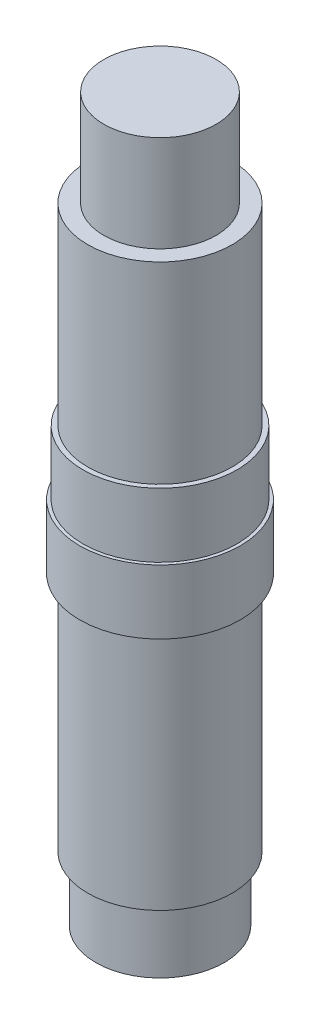
ISO-10303-21;
HEADER;
FILE_DESCRIPTION(('STEP AP214'),'2;1');
FILE_NAME('part.step','',(''),(''),'','','');
FILE_SCHEMA(('AUTOMOTIVE_DESIGN { 1 0 10303 214 1 1 1 1 }'));
ENDSEC;
DATA;
#1=APPLICATION_CONTEXT('core data for automotive mechanical design processes');
#2=APPLICATION_PROTOCOL_DEFINITION('international standard','automotive_design',2000,#1);
#3=PRODUCT_CONTEXT('',#1,'mechanical');
#4=PRODUCT('Part','Part','',(#3));
#5=PRODUCT_RELATED_PRODUCT_CATEGORY('part','',(#4));
#6=PRODUCT_DEFINITION_FORMATION('','',#4);
#7=PRODUCT_DEFINITION_CONTEXT('part definition',#1,'design');
#8=PRODUCT_DEFINITION('design','',#6,#7);
#9=PRODUCT_DEFINITION_SHAPE('','',#8);
#10=(LENGTH_UNIT() NAMED_UNIT(*) SI_UNIT(.MILLI.,.METRE.));
#11=(NAMED_UNIT(*) PLANE_ANGLE_UNIT() SI_UNIT($,.RADIAN.));
#12=(NAMED_UNIT(*) SI_UNIT($,.STERADIAN.) SOLID_ANGLE_UNIT());
#13=UNCERTAINTY_MEASURE_WITH_UNIT(LENGTH_MEASURE(1.E-05),#10,'distance_accuracy_value','');
#14=(GEOMETRIC_REPRESENTATION_CONTEXT(3) GLOBAL_UNCERTAINTY_ASSIGNED_CONTEXT((#13)) GLOBAL_UNIT_ASSIGNED_CONTEXT((#10,
#11,#12)) REPRESENTATION_CONTEXT('',''));
#15=CARTESIAN_POINT('',(0.,0.,0.));
#16=DIRECTION('',(0.,0.,1.));
#17=DIRECTION('',(1.,0.,0.));
#18=AXIS2_PLACEMENT_3D('',#15,#16,#17);
#19=CARTESIAN_POINT('',(0.,225.,0.));
#20=DIRECTION('',(0.,-1.,0.));
#21=DIRECTION('',(0.,0.,-1.));
#22=AXIS2_PLACEMENT_3D('',#19,#20,#21);
#23=CYLINDRICAL_SURFACE('',#22,17.5);
#24=CARTESIAN_POINT('',(0.,225.,0.));
#25=DIRECTION('',(0.,1.,0.));
#26=DIRECTION('',(0.,0.,1.));
#27=AXIS2_PLACEMENT_3D('',#24,#25,#26);
#28=CIRCLE('',#27,17.5);
#29=CARTESIAN_POINT('',(0.,225.,17.5));
#30=VERTEX_POINT('',#29);
#31=EDGE_CURVE('E11',#30,#30,#28,.T.);
#32=ORIENTED_EDGE('',*,*,#31,.F.);
#33=EDGE_LOOP('',(#32));
#34=FACE_BOUND('',#33,.T.);
#35=CARTESIAN_POINT('',(0.,195.,0.));
#36=DIRECTION('',(0.,1.,0.));
#37=DIRECTION('',(0.,0.,1.));
#38=AXIS2_PLACEMENT_3D('',#35,#36,#37);
#39=CIRCLE('',#38,17.5);
#40=CARTESIAN_POINT('',(0.,195.,17.5));
#41=VERTEX_POINT('',#40);
#42=EDGE_CURVE('E43',#41,#41,#39,.T.);
#43=ORIENTED_EDGE('',*,*,#42,.T.);
#44=EDGE_LOOP('',(#43));
#45=FACE_BOUND('',#44,.T.);
#46=ADVANCED_FACE('F40',(#34,#45),#23,.T.);
#47=CARTESIAN_POINT('',(0.,225.,0.));
#48=DIRECTION('',(0.,1.,0.));
#49=DIRECTION('',(0.,0.,1.));
#50=AXIS2_PLACEMENT_3D('',#47,#48,#49);
#51=PLANE('',#50);
#52=ORIENTED_EDGE('',*,*,#31,.T.);
#53=EDGE_LOOP('',(#52));
#54=FACE_BOUND('',#53,.T.);
#55=ADVANCED_FACE('F55',(#54),#51,.T.);
#56=CARTESIAN_POINT('',(0.,195.,0.));
#57=DIRECTION('',(0.,1.,0.));
#58=DIRECTION('',(0.,0.,1.));
#59=AXIS2_PLACEMENT_3D('',#56,#57,#58);
#60=PLANE('',#59);
#61=ORIENTED_EDGE('',*,*,#42,.F.);
#62=EDGE_LOOP('',(#61));
#63=FACE_BOUND('',#62,.T.);
#64=ADVANCED_FACE('F53',(#63),#60,.F.);
#65=CLOSED_SHELL('',(#46,#55,#64));
#66=MANIFOLD_SOLID_BREP('B2',#65);
#67=CARTESIAN_POINT('',(0.,195.,0.));
#68=DIRECTION('',(0.,-1.,0.));
#69=DIRECTION('',(0.,0.,-1.));
#70=AXIS2_PLACEMENT_3D('',#67,#68,#69);
#71=CYLINDRICAL_SURFACE('',#70,22.5);
#72=CARTESIAN_POINT('',(0.,195.,0.));
#73=DIRECTION('',(0.,1.,0.));
#74=DIRECTION('',(0.,0.,1.));
#75=AXIS2_PLACEMENT_3D('',#72,#73,#74);
#76=CIRCLE('',#75,22.5);
#77=CARTESIAN_POINT('',(0.,195.,22.5));
#78=VERTEX_POINT('',#77);
#79=EDGE_CURVE('E39',#78,#78,#76,.T.);
#80=ORIENTED_EDGE('',*,*,#79,.F.);
#81=EDGE_LOOP('',(#80));
#82=FACE_BOUND('',#81,.T.);
#83=CARTESIAN_POINT('',(0.,135.,0.));
#84=DIRECTION('',(0.,1.,0.));
#85=DIRECTION('',(0.,0.,1.));
#86=AXIS2_PLACEMENT_3D('',#83,#84,#85);
#87=CIRCLE('',#86,22.5);
#88=CARTESIAN_POINT('',(0.,135.,22.5));
#89=VERTEX_POINT('',#88);
#90=EDGE_CURVE('E92',#89,#89,#87,.T.);
#91=ORIENTED_EDGE('',*,*,#90,.T.);
#92=EDGE_LOOP('',(#91));
#93=FACE_BOUND('',#92,.T.);
#94=ADVANCED_FACE('F89',(#82,#93),#71,.T.);
#95=CARTESIAN_POINT('',(0.,195.,0.));
#96=DIRECTION('',(0.,1.,0.));
#97=DIRECTION('',(0.,0.,1.));
#98=AXIS2_PLACEMENT_3D('',#95,#96,#97);
#99=PLANE('',#98);
#100=ORIENTED_EDGE('',*,*,#79,.T.);
#101=EDGE_LOOP('',(#100));
#102=FACE_BOUND('',#101,.T.);
#103=ADVANCED_FACE('F104',(#102),#99,.T.);
#104=CARTESIAN_POINT('',(0.,135.,0.));
#105=DIRECTION('',(0.,1.,0.));
#106=DIRECTION('',(0.,0.,1.));
#107=AXIS2_PLACEMENT_3D('',#104,#105,#106);
#108=PLANE('',#107);
#109=ORIENTED_EDGE('',*,*,#90,.F.);
#110=EDGE_LOOP('',(#109));
#111=FACE_BOUND('',#110,.T.);
#112=ADVANCED_FACE('F102',(#111),#108,.F.);
#113=CLOSED_SHELL('',(#94,#103,#112));
#114=MANIFOLD_SOLID_BREP('B6',#113);
#115=CARTESIAN_POINT('',(0.,135.,0.));
#116=DIRECTION('',(0.,-1.,0.));
#117=DIRECTION('',(0.,0.,-1.));
#118=AXIS2_PLACEMENT_3D('',#115,#116,#117);
#119=CYLINDRICAL_SURFACE('',#118,24.);
#120=CARTESIAN_POINT('',(0.,135.,0.));
#121=DIRECTION('',(0.,1.,0.));
#122=DIRECTION('',(0.,0.,1.));
#123=AXIS2_PLACEMENT_3D('',#120,#121,#122);
#124=CIRCLE('',#123,24.);
#125=CARTESIAN_POINT('',(0.,135.,24.));
#126=VERTEX_POINT('',#125);
#127=EDGE_CURVE('E88',#126,#126,#124,.T.);
#128=ORIENTED_EDGE('',*,*,#127,.F.);
#129=EDGE_LOOP('',(#128));
#130=FACE_BOUND('',#129,.T.);
#131=CARTESIAN_POINT('',(0.,115.,0.));
#132=DIRECTION('',(0.,1.,0.));
#133=DIRECTION('',(0.,0.,1.));
#134=AXIS2_PLACEMENT_3D('',#131,#132,#133);
#135=CIRCLE('',#134,24.);
#136=CARTESIAN_POINT('',(0.,115.,24.));
#137=VERTEX_POINT('',#136);
#138=EDGE_CURVE('E141',#137,#137,#135,.T.);
#139=ORIENTED_EDGE('',*,*,#138,.T.);
#140=EDGE_LOOP('',(#139));
#141=FACE_BOUND('',#140,.T.);
#142=ADVANCED_FACE('F138',(#130,#141),#119,.T.);
#143=CARTESIAN_POINT('',(0.,135.,0.));
#144=DIRECTION('',(0.,1.,0.));
#145=DIRECTION('',(0.,0.,1.));
#146=AXIS2_PLACEMENT_3D('',#143,#144,#145);
#147=PLANE('',#146);
#148=ORIENTED_EDGE('',*,*,#127,.T.);
#149=EDGE_LOOP('',(#148));
#150=FACE_BOUND('',#149,.T.);
#151=ADVANCED_FACE('F153',(#150),#147,.T.);
#152=CARTESIAN_POINT('',(0.,115.,0.));
#153=DIRECTION('',(0.,1.,0.));
#154=DIRECTION('',(0.,0.,1.));
#155=AXIS2_PLACEMENT_3D('',#152,#153,#154);
#156=PLANE('',#155);
#157=ORIENTED_EDGE('',*,*,#138,.F.);
#158=EDGE_LOOP('',(#157));
#159=FACE_BOUND('',#158,.T.);
#160=ADVANCED_FACE('F151',(#159),#156,.F.);
#161=CLOSED_SHELL('',(#142,#151,#160));
#162=MANIFOLD_SOLID_BREP('B34',#161);
#163=CARTESIAN_POINT('',(0.,115.,0.));
#164=DIRECTION('',(0.,-1.,0.));
#165=DIRECTION('',(0.,0.,-1.));
#166=AXIS2_PLACEMENT_3D('',#163,#164,#165);
#167=CYLINDRICAL_SURFACE('',#166,25.);
#168=CARTESIAN_POINT('',(0.,115.,0.));
#169=DIRECTION('',(0.,1.,0.));
#170=DIRECTION('',(0.,0.,1.));
#171=AXIS2_PLACEMENT_3D('',#168,#169,#170);
#172=CIRCLE('',#171,25.);
#173=CARTESIAN_POINT('',(0.,115.,25.));
#174=VERTEX_POINT('',#173);
#175=EDGE_CURVE('E137',#174,#174,#172,.T.);
#176=ORIENTED_EDGE('',*,*,#175,.F.);
#177=EDGE_LOOP('',(#176));
#178=FACE_BOUND('',#177,.T.);
#179=CARTESIAN_POINT('',(0.,95.,0.));
#180=DIRECTION('',(0.,1.,0.));
#181=DIRECTION('',(0.,0.,1.));
#182=AXIS2_PLACEMENT_3D('',#179,#180,#181);
#183=CIRCLE('',#182,25.);
#184=CARTESIAN_POINT('',(0.,95.,25.));
#185=VERTEX_POINT('',#184);
#186=EDGE_CURVE('E190',#185,#185,#183,.T.);
#187=ORIENTED_EDGE('',*,*,#186,.T.);
#188=EDGE_LOOP('',(#187));
#189=FACE_BOUND('',#188,.T.);
#190=ADVANCED_FACE('F187',(#178,#189),#167,.T.);
#191=CARTESIAN_POINT('',(0.,115.,0.));
#192=DIRECTION('',(0.,1.,0.));
#193=DIRECTION('',(0.,0.,1.));
#194=AXIS2_PLACEMENT_3D('',#191,#192,#193);
#195=PLANE('',#194);
#196=ORIENTED_EDGE('',*,*,#175,.T.);
#197=EDGE_LOOP('',(#196));
#198=FACE_BOUND('',#197,.T.);
#199=ADVANCED_FACE('F202',(#198),#195,.T.);
#200=CARTESIAN_POINT('',(0.,95.,0.));
#201=DIRECTION('',(0.,1.,0.));
#202=DIRECTION('',(0.,0.,1.));
#203=AXIS2_PLACEMENT_3D('',#200,#201,#202);
#204=PLANE('',#203);
#205=ORIENTED_EDGE('',*,*,#186,.F.);
#206=EDGE_LOOP('',(#205));
#207=FACE_BOUND('',#206,.T.);
#208=ADVANCED_FACE('F200',(#207),#204,.F.);
#209=CLOSED_SHELL('',(#190,#199,#208));
#210=MANIFOLD_SOLID_BREP('B83',#209);
#211=CARTESIAN_POINT('',(0.,95.,0.));
#212=DIRECTION('',(0.,-1.,0.));
#213=DIRECTION('',(0.,0.,-1.));
#214=AXIS2_PLACEMENT_3D('',#211,#212,#213);
#215=CYLINDRICAL_SURFACE('',#214,22.5);
#216=CARTESIAN_POINT('',(0.,95.,0.));
#217=DIRECTION('',(0.,1.,0.));
#218=DIRECTION('',(0.,0.,1.));
#219=AXIS2_PLACEMENT_3D('',#216,#217,#218);
#220=CIRCLE('',#219,22.5);
#221=CARTESIAN_POINT('',(0.,95.,22.5));
#222=VERTEX_POINT('',#221);
#223=EDGE_CURVE('E186',#222,#222,#220,.T.);
#224=ORIENTED_EDGE('',*,*,#223,.F.);
#225=EDGE_LOOP('',(#224));
#226=FACE_BOUND('',#225,.T.);
#227=CARTESIAN_POINT('',(0.,20.,0.));
#228=DIRECTION('',(0.,1.,0.));
#229=DIRECTION('',(0.,0.,1.));
#230=AXIS2_PLACEMENT_3D('',#227,#228,#229);
#231=CIRCLE('',#230,22.5);
#232=CARTESIAN_POINT('',(0.,20.,22.5));
#233=VERTEX_POINT('',#232);
#234=EDGE_CURVE('E238',#233,#233,#231,.T.);
#235=ORIENTED_EDGE('',*,*,#234,.T.);
#236=EDGE_LOOP('',(#235));
#237=FACE_BOUND('',#236,.T.);
#238=ADVANCED_FACE('F235',(#226,#237),#215,.T.);
#239=CARTESIAN_POINT('',(0.,95.,0.));
#240=DIRECTION('',(0.,1.,0.));
#241=DIRECTION('',(0.,0.,1.));
#242=AXIS2_PLACEMENT_3D('',#239,#240,#241);
#243=PLANE('',#242);
#244=ORIENTED_EDGE('',*,*,#223,.T.);
#245=EDGE_LOOP('',(#244));
#246=FACE_BOUND('',#245,.T.);
#247=ADVANCED_FACE('F250',(#246),#243,.T.);
#248=CARTESIAN_POINT('',(0.,20.,0.));
#249=DIRECTION('',(0.,1.,0.));
#250=DIRECTION('',(0.,0.,1.));
#251=AXIS2_PLACEMENT_3D('',#248,#249,#250);
#252=PLANE('',#251);
#253=ORIENTED_EDGE('',*,*,#234,.F.);
#254=EDGE_LOOP('',(#253));
#255=FACE_BOUND('',#254,.T.);
#256=ADVANCED_FACE('F248',(#255),#252,.F.);
#257=CLOSED_SHELL('',(#238,#247,#256));
#258=MANIFOLD_SOLID_BREP('B132',#257);
#259=CARTESIAN_POINT('',(0.,20.,0.));
#260=DIRECTION('',(0.,-1.,0.));
#261=DIRECTION('',(0.,0.,-1.));
#262=AXIS2_PLACEMENT_3D('',#259,#260,#261);
#263=CYLINDRICAL_SURFACE('',#262,20.);
#264=CARTESIAN_POINT('',(0.,20.,0.));
#265=DIRECTION('',(0.,1.,0.));
#266=DIRECTION('',(0.,0.,1.));
#267=AXIS2_PLACEMENT_3D('',#264,#265,#266);
#268=CIRCLE('',#267,20.);
#269=CARTESIAN_POINT('',(0.,20.,20.));
#270=VERTEX_POINT('',#269);
#271=EDGE_CURVE('E234',#270,#270,#268,.T.);
#272=ORIENTED_EDGE('',*,*,#271,.F.);
#273=EDGE_LOOP('',(#272));
#274=FACE_BOUND('',#273,.T.);
#275=CARTESIAN_POINT('',(0.,0.,0.));
#276=DIRECTION('',(0.,1.,0.));
#277=DIRECTION('',(0.,0.,1.));
#278=AXIS2_PLACEMENT_3D('',#275,#276,#277);
#279=CIRCLE('',#278,20.);
#280=CARTESIAN_POINT('',(0.,0.,20.));
#281=VERTEX_POINT('',#280);
#282=EDGE_CURVE('E279',#281,#281,#279,.T.);
#283=ORIENTED_EDGE('',*,*,#282,.T.);
#284=EDGE_LOOP('',(#283));
#285=FACE_BOUND('',#284,.T.);
#286=ADVANCED_FACE('F276',(#274,#285),#263,.T.);
#287=CARTESIAN_POINT('',(0.,20.,0.));
#288=DIRECTION('',(0.,1.,0.));
#289=DIRECTION('',(0.,0.,1.));
#290=AXIS2_PLACEMENT_3D('',#287,#288,#289);
#291=PLANE('',#290);
#292=ORIENTED_EDGE('',*,*,#271,.T.);
#293=EDGE_LOOP('',(#292));
#294=FACE_BOUND('',#293,.T.);
#295=ADVANCED_FACE('F291',(#294),#291,.T.);
#296=CARTESIAN_POINT('',(0.,0.,0.));
#297=DIRECTION('',(0.,1.,0.));
#298=DIRECTION('',(0.,0.,1.));
#299=AXIS2_PLACEMENT_3D('',#296,#297,#298);
#300=PLANE('',#299);
#301=ORIENTED_EDGE('',*,*,#282,.F.);
#302=EDGE_LOOP('',(#301));
#303=FACE_BOUND('',#302,.T.);
#304=ADVANCED_FACE('F289',(#303),#300,.F.);
#305=CLOSED_SHELL('',(#286,#295,#304));
#306=MANIFOLD_SOLID_BREP('B181',#305);
#307=ADVANCED_BREP_SHAPE_REPRESENTATION('',(#18,#66,#114,#162,#210,#258,#306),#14);
#308=SHAPE_DEFINITION_REPRESENTATION(#9,#307);
ENDSEC;
END-ISO-10303-21;
